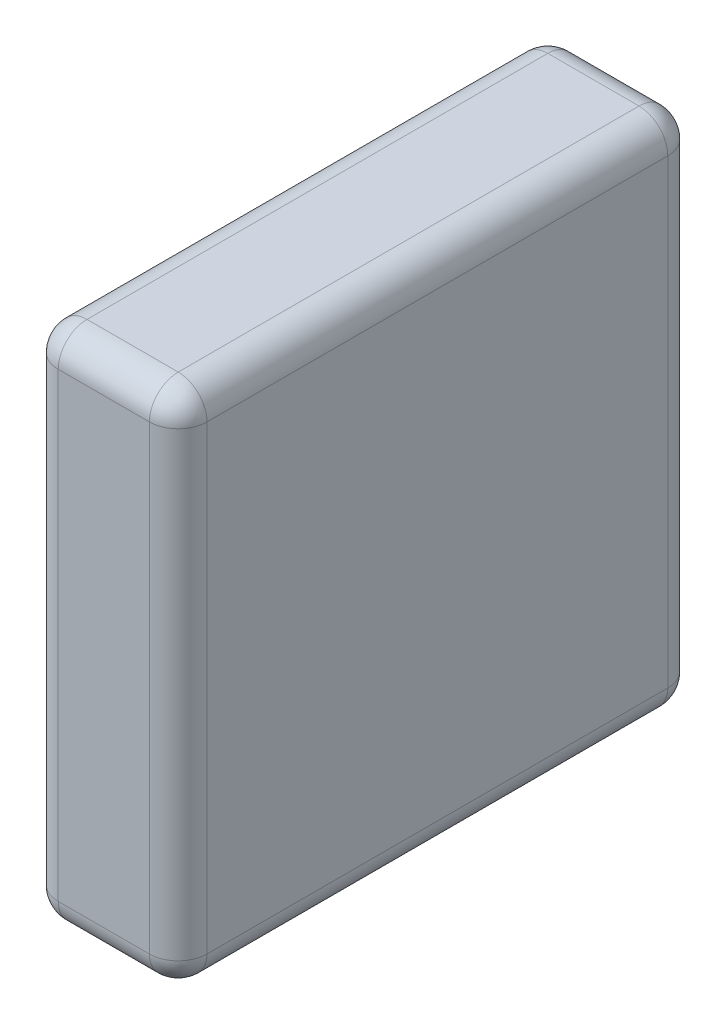
ISO-10303-21;
HEADER;
FILE_DESCRIPTION(('STEP AP214'),'2;1');
FILE_NAME('part.step','',(''),(''),'','','');
FILE_SCHEMA(('AUTOMOTIVE_DESIGN { 1 0 10303 214 1 1 1 1 }'));
ENDSEC;
DATA;
#1=APPLICATION_CONTEXT('core data for automotive mechanical design processes');
#2=APPLICATION_PROTOCOL_DEFINITION('international standard','automotive_design',2000,#1);
#3=PRODUCT_CONTEXT('',#1,'mechanical');
#4=PRODUCT('Part','Part','',(#3));
#5=PRODUCT_RELATED_PRODUCT_CATEGORY('part','',(#4));
#6=PRODUCT_DEFINITION_FORMATION('','',#4);
#7=PRODUCT_DEFINITION_CONTEXT('part definition',#1,'design');
#8=PRODUCT_DEFINITION('design','',#6,#7);
#9=PRODUCT_DEFINITION_SHAPE('','',#8);
#10=(LENGTH_UNIT() NAMED_UNIT(*) SI_UNIT(.MILLI.,.METRE.));
#11=(NAMED_UNIT(*) PLANE_ANGLE_UNIT() SI_UNIT($,.RADIAN.));
#12=(NAMED_UNIT(*) SI_UNIT($,.STERADIAN.) SOLID_ANGLE_UNIT());
#13=UNCERTAINTY_MEASURE_WITH_UNIT(LENGTH_MEASURE(1.E-05),#10,'distance_accuracy_value','');
#14=(GEOMETRIC_REPRESENTATION_CONTEXT(3) GLOBAL_UNCERTAINTY_ASSIGNED_CONTEXT((#13)) GLOBAL_UNIT_ASSIGNED_CONTEXT((#10,
#11,#12)) REPRESENTATION_CONTEXT('',''));
#15=CARTESIAN_POINT('',(0.,0.,0.));
#16=DIRECTION('',(0.,0.,1.));
#17=DIRECTION('',(1.,0.,0.));
#18=AXIS2_PLACEMENT_3D('',#15,#16,#17);
#19=CARTESIAN_POINT('',(4.75,24.,24.));
#20=DIRECTION('',(0.,-1.,0.));
#21=DIRECTION('',(1.,0.,0.));
#22=AXIS2_PLACEMENT_3D('',#19,#20,#21);
#23=SPHERICAL_SURFACE('',#22,3.);
#24=CARTESIAN_POINT('',(4.75,24.,24.));
#25=DIRECTION('',(0.,0.,-1.));
#26=DIRECTION('',(1.,0.,0.));
#27=AXIS2_PLACEMENT_3D('',#24,#25,#26);
#28=CIRCLE('',#27,3.);
#29=CARTESIAN_POINT('',(4.75,27.,24.));
#30=VERTEX_POINT('',#29);
#31=CARTESIAN_POINT('',(7.75,24.,24.));
#32=VERTEX_POINT('',#31);
#33=EDGE_CURVE('E10',#30,#32,#28,.T.);
#34=ORIENTED_EDGE('',*,*,#33,.F.);
#35=CARTESIAN_POINT('',(4.75,24.,24.));
#36=DIRECTION('',(1.,0.,0.));
#37=DIRECTION('',(0.,0.,1.));
#38=AXIS2_PLACEMENT_3D('',#35,#36,#37);
#39=CIRCLE('',#38,3.);
#40=CARTESIAN_POINT('',(4.75,24.,27.));
#41=VERTEX_POINT('',#40);
#42=EDGE_CURVE('E203',#30,#41,#39,.T.);
#43=ORIENTED_EDGE('',*,*,#42,.T.);
#44=CARTESIAN_POINT('',(4.75,24.,24.));
#45=DIRECTION('',(0.,-1.,0.));
#46=DIRECTION('',(1.,0.,0.));
#47=AXIS2_PLACEMENT_3D('',#44,#45,#46);
#48=CIRCLE('',#47,3.);
#49=EDGE_CURVE('E282',#32,#41,#48,.T.);
#50=ORIENTED_EDGE('',*,*,#49,.F.);
#51=EDGE_LOOP('',(#34,#43,#50));
#52=FACE_BOUND('',#51,.T.);
#53=ADVANCED_FACE('F16',(#52),#23,.T.);
#54=CARTESIAN_POINT('',(4.75,24.,-24.));
#55=DIRECTION('',(0.,0.,1.));
#56=DIRECTION('',(1.,0.,0.));
#57=AXIS2_PLACEMENT_3D('',#54,#55,#56);
#58=SPHERICAL_SURFACE('',#57,3.);
#59=CARTESIAN_POINT('',(4.75,24.,-24.));
#60=DIRECTION('',(0.,-1.,0.));
#61=DIRECTION('',(1.,0.,0.));
#62=AXIS2_PLACEMENT_3D('',#59,#60,#61);
#63=CIRCLE('',#62,3.);
#64=CARTESIAN_POINT('',(4.75,24.,-27.));
#65=VERTEX_POINT('',#64);
#66=CARTESIAN_POINT('',(7.75,24.,-24.));
#67=VERTEX_POINT('',#66);
#68=EDGE_CURVE('E272',#65,#67,#63,.T.);
#69=ORIENTED_EDGE('',*,*,#68,.F.);
#70=CARTESIAN_POINT('',(4.75,24.,-24.));
#71=DIRECTION('',(1.,0.,0.));
#72=DIRECTION('',(0.,1.,0.));
#73=AXIS2_PLACEMENT_3D('',#70,#71,#72);
#74=CIRCLE('',#73,3.);
#75=CARTESIAN_POINT('',(4.75,27.,-24.));
#76=VERTEX_POINT('',#75);
#77=EDGE_CURVE('E260',#65,#76,#74,.T.);
#78=ORIENTED_EDGE('',*,*,#77,.T.);
#79=CARTESIAN_POINT('',(4.75,24.,-24.));
#80=DIRECTION('',(0.,0.,1.));
#81=DIRECTION('',(1.,0.,0.));
#82=AXIS2_PLACEMENT_3D('',#79,#80,#81);
#83=CIRCLE('',#82,3.);
#84=EDGE_CURVE('E24',#67,#76,#83,.T.);
#85=ORIENTED_EDGE('',*,*,#84,.F.);
#86=EDGE_LOOP('',(#69,#78,#85));
#87=FACE_BOUND('',#86,.T.);
#88=ADVANCED_FACE('F295',(#87),#58,.T.);
#89=CARTESIAN_POINT('',(7.75,-27.,-27.));
#90=DIRECTION('',(1.,0.,0.));
#91=DIRECTION('',(0.,1.,0.));
#92=AXIS2_PLACEMENT_3D('',#89,#90,#91);
#93=PLANE('',#92);
#94=DIRECTION('',(0.,0.,1.));
#95=VECTOR('',#94,1.);
#96=CARTESIAN_POINT('',(7.75,-24.,-27.));
#97=LINE('',#96,#95);
#98=CARTESIAN_POINT('',(7.75,-24.,-24.));
#99=VERTEX_POINT('',#98);
#100=CARTESIAN_POINT('',(7.75,-24.,24.));
#101=VERTEX_POINT('',#100);
#102=EDGE_CURVE('E256',#99,#101,#97,.T.);
#103=ORIENTED_EDGE('',*,*,#102,.F.);
#104=DIRECTION('',(0.,1.,0.));
#105=VECTOR('',#104,1.);
#106=CARTESIAN_POINT('',(7.75,-27.,-24.));
#107=LINE('',#106,#105);
#108=EDGE_CURVE('E208',#99,#67,#107,.T.);
#109=ORIENTED_EDGE('',*,*,#108,.T.);
#110=DIRECTION('',(0.,0.,1.));
#111=VECTOR('',#110,1.);
#112=CARTESIAN_POINT('',(7.75,24.,-27.));
#113=LINE('',#112,#111);
#114=EDGE_CURVE('E288',#67,#32,#113,.T.);
#115=ORIENTED_EDGE('',*,*,#114,.T.);
#116=DIRECTION('',(0.,1.,0.));
#117=VECTOR('',#116,1.);
#118=CARTESIAN_POINT('',(7.75,-27.,24.));
#119=LINE('',#118,#117);
#120=EDGE_CURVE('E207',#101,#32,#119,.T.);
#121=ORIENTED_EDGE('',*,*,#120,.F.);
#122=EDGE_LOOP('',(#103,#109,#115,#121));
#123=FACE_BOUND('',#122,.T.);
#124=ADVANCED_FACE('F379',(#123),#93,.T.);
#125=CARTESIAN_POINT('',(4.75,-24.,24.));
#126=DIRECTION('',(0.,0.,-1.));
#127=DIRECTION('',(1.,0.,0.));
#128=AXIS2_PLACEMENT_3D('',#125,#126,#127);
#129=SPHERICAL_SURFACE('',#128,3.);
#130=CARTESIAN_POINT('',(4.75,-24.,24.));
#131=DIRECTION('',(0.,1.,0.));
#132=DIRECTION('',(1.,0.,0.));
#133=AXIS2_PLACEMENT_3D('',#130,#131,#132);
#134=CIRCLE('',#133,3.);
#135=CARTESIAN_POINT('',(4.75,-24.,27.));
#136=VERTEX_POINT('',#135);
#137=EDGE_CURVE('E285',#136,#101,#134,.T.);
#138=ORIENTED_EDGE('',*,*,#137,.F.);
#139=CARTESIAN_POINT('',(4.75,-24.,24.));
#140=DIRECTION('',(1.,0.,0.));
#141=DIRECTION('',(0.,-1.,0.));
#142=AXIS2_PLACEMENT_3D('',#139,#140,#141);
#143=CIRCLE('',#142,3.);
#144=CARTESIAN_POINT('',(4.75,-27.,24.));
#145=VERTEX_POINT('',#144);
#146=EDGE_CURVE('E140',#136,#145,#143,.T.);
#147=ORIENTED_EDGE('',*,*,#146,.T.);
#148=CARTESIAN_POINT('',(4.75,-24.,24.));
#149=DIRECTION('',(0.,0.,-1.));
#150=DIRECTION('',(1.,0.,0.));
#151=AXIS2_PLACEMENT_3D('',#148,#149,#150);
#152=CIRCLE('',#151,3.);
#153=EDGE_CURVE('E255',#101,#145,#152,.T.);
#154=ORIENTED_EDGE('',*,*,#153,.F.);
#155=EDGE_LOOP('',(#138,#147,#154));
#156=FACE_BOUND('',#155,.T.);
#157=ADVANCED_FACE('F374',(#156),#129,.T.);
#158=CARTESIAN_POINT('',(4.75,-24.,-24.));
#159=DIRECTION('',(0.,0.,1.));
#160=DIRECTION('',(1.,0.,0.));
#161=AXIS2_PLACEMENT_3D('',#158,#159,#160);
#162=SPHERICAL_SURFACE('',#161,3.);
#163=CARTESIAN_POINT('',(4.75,-24.,-24.));
#164=DIRECTION('',(0.,0.,-1.));
#165=DIRECTION('',(1.,0.,0.));
#166=AXIS2_PLACEMENT_3D('',#163,#164,#165);
#167=CIRCLE('',#166,3.);
#168=CARTESIAN_POINT('',(4.75,-27.,-24.));
#169=VERTEX_POINT('',#168);
#170=EDGE_CURVE('E261',#99,#169,#167,.T.);
#171=ORIENTED_EDGE('',*,*,#170,.T.);
#172=CARTESIAN_POINT('',(4.75,-24.,-24.));
#173=DIRECTION('',(-1.,0.,0.));
#174=DIRECTION('',(0.,-1.,0.));
#175=AXIS2_PLACEMENT_3D('',#172,#173,#174);
#176=CIRCLE('',#175,3.);
#177=CARTESIAN_POINT('',(4.75,-24.,-27.));
#178=VERTEX_POINT('',#177);
#179=EDGE_CURVE('E249',#178,#169,#176,.T.);
#180=ORIENTED_EDGE('',*,*,#179,.F.);
#181=CARTESIAN_POINT('',(4.75,-24.,-24.));
#182=DIRECTION('',(0.,-1.,0.));
#183=DIRECTION('',(1.,0.,0.));
#184=AXIS2_PLACEMENT_3D('',#181,#182,#183);
#185=CIRCLE('',#184,3.);
#186=EDGE_CURVE('E268',#178,#99,#185,.T.);
#187=ORIENTED_EDGE('',*,*,#186,.T.);
#188=EDGE_LOOP('',(#171,#180,#187));
#189=FACE_BOUND('',#188,.T.);
#190=ADVANCED_FACE('F406',(#189),#162,.T.);
#191=CARTESIAN_POINT('',(4.75,24.,-27.));
#192=DIRECTION('',(0.,0.,1.));
#193=DIRECTION('',(1.,0.,0.));
#194=AXIS2_PLACEMENT_3D('',#191,#192,#193);
#195=CYLINDRICAL_SURFACE('',#194,3.);
#196=ORIENTED_EDGE('',*,*,#114,.F.);
#197=ORIENTED_EDGE('',*,*,#84,.T.);
#198=DIRECTION('',(0.,0.,1.));
#199=VECTOR('',#198,1.);
#200=CARTESIAN_POINT('',(4.75,27.,-27.));
#201=LINE('',#200,#199);
#202=EDGE_CURVE('E197',#76,#30,#201,.T.);
#203=ORIENTED_EDGE('',*,*,#202,.T.);
#204=ORIENTED_EDGE('',*,*,#33,.T.);
#205=EDGE_LOOP('',(#196,#197,#203,#204));
#206=FACE_BOUND('',#205,.T.);
#207=ADVANCED_FACE('F292',(#206),#195,.T.);
#208=CARTESIAN_POINT('',(4.75,-27.,24.));
#209=DIRECTION('',(0.,1.,0.));
#210=DIRECTION('',(1.,0.,0.));
#211=AXIS2_PLACEMENT_3D('',#208,#209,#210);
#212=CYLINDRICAL_SURFACE('',#211,3.);
#213=ORIENTED_EDGE('',*,*,#120,.T.);
#214=ORIENTED_EDGE('',*,*,#49,.T.);
#215=DIRECTION('',(0.,1.,0.));
#216=VECTOR('',#215,1.);
#217=CARTESIAN_POINT('',(4.75,-27.,27.));
#218=LINE('',#217,#216);
#219=EDGE_CURVE('E146',#136,#41,#218,.T.);
#220=ORIENTED_EDGE('',*,*,#219,.F.);
#221=ORIENTED_EDGE('',*,*,#137,.T.);
#222=EDGE_LOOP('',(#213,#214,#220,#221));
#223=FACE_BOUND('',#222,.T.);
#224=ADVANCED_FACE('F377',(#223),#212,.T.);
#225=CARTESIAN_POINT('',(-7.75,24.,24.));
#226=DIRECTION('',(1.,0.,0.));
#227=DIRECTION('',(0.,1.,0.));
#228=AXIS2_PLACEMENT_3D('',#225,#226,#227);
#229=CYLINDRICAL_SURFACE('',#228,3.);
#230=CARTESIAN_POINT('',(-4.75,24.,24.));
#231=DIRECTION('',(1.,0.,0.));
#232=DIRECTION('',(0.,0.,1.));
#233=AXIS2_PLACEMENT_3D('',#230,#231,#232);
#234=CIRCLE('',#233,3.);
#235=CARTESIAN_POINT('',(-4.75,27.,24.));
#236=VERTEX_POINT('',#235);
#237=CARTESIAN_POINT('',(-4.75,24.,27.));
#238=VERTEX_POINT('',#237);
#239=EDGE_CURVE('E198',#236,#238,#234,.T.);
#240=ORIENTED_EDGE('',*,*,#239,.T.);
#241=DIRECTION('',(1.,0.,0.));
#242=VECTOR('',#241,1.);
#243=CARTESIAN_POINT('',(-7.75,24.,27.));
#244=LINE('',#243,#242);
#245=EDGE_CURVE('E165',#238,#41,#244,.T.);
#246=ORIENTED_EDGE('',*,*,#245,.T.);
#247=ORIENTED_EDGE('',*,*,#42,.F.);
#248=DIRECTION('',(1.,0.,0.));
#249=VECTOR('',#248,1.);
#250=CARTESIAN_POINT('',(-7.75,27.,24.));
#251=LINE('',#250,#249);
#252=EDGE_CURVE('E193',#236,#30,#251,.T.);
#253=ORIENTED_EDGE('',*,*,#252,.F.);
#254=EDGE_LOOP('',(#240,#246,#247,#253));
#255=FACE_BOUND('',#254,.T.);
#256=ADVANCED_FACE('F306',(#255),#229,.T.);
#257=CARTESIAN_POINT('',(4.75,-27.,-24.));
#258=DIRECTION('',(0.,1.,0.));
#259=DIRECTION('',(1.,0.,0.));
#260=AXIS2_PLACEMENT_3D('',#257,#258,#259);
#261=CYLINDRICAL_SURFACE('',#260,3.);
#262=ORIENTED_EDGE('',*,*,#186,.F.);
#263=DIRECTION('',(0.,1.,0.));
#264=VECTOR('',#263,1.);
#265=CARTESIAN_POINT('',(4.75,-27.,-27.));
#266=LINE('',#265,#264);
#267=EDGE_CURVE('E229',#178,#65,#266,.T.);
#268=ORIENTED_EDGE('',*,*,#267,.T.);
#269=ORIENTED_EDGE('',*,*,#68,.T.);
#270=ORIENTED_EDGE('',*,*,#108,.F.);
#271=EDGE_LOOP('',(#262,#268,#269,#270));
#272=FACE_BOUND('',#271,.T.);
#273=ADVANCED_FACE('F432',(#272),#261,.T.);
#274=CARTESIAN_POINT('',(-7.75,24.,-24.));
#275=DIRECTION('',(1.,0.,0.));
#276=DIRECTION('',(0.,1.,0.));
#277=AXIS2_PLACEMENT_3D('',#274,#275,#276);
#278=CYLINDRICAL_SURFACE('',#277,3.);
#279=DIRECTION('',(1.,0.,0.));
#280=VECTOR('',#279,1.);
#281=CARTESIAN_POINT('',(-7.75,27.,-24.));
#282=LINE('',#281,#280);
#283=CARTESIAN_POINT('',(-4.75,27.,-24.));
#284=VERTEX_POINT('',#283);
#285=EDGE_CURVE('E228',#284,#76,#282,.T.);
#286=ORIENTED_EDGE('',*,*,#285,.T.);
#287=ORIENTED_EDGE('',*,*,#77,.F.);
#288=DIRECTION('',(1.,0.,0.));
#289=VECTOR('',#288,1.);
#290=CARTESIAN_POINT('',(-7.75,24.,-27.));
#291=LINE('',#290,#289);
#292=CARTESIAN_POINT('',(-4.75,24.,-27.));
#293=VERTEX_POINT('',#292);
#294=EDGE_CURVE('E225',#293,#65,#291,.T.);
#295=ORIENTED_EDGE('',*,*,#294,.F.);
#296=CARTESIAN_POINT('',(-4.75,24.,-24.));
#297=DIRECTION('',(1.,0.,0.));
#298=DIRECTION('',(0.,1.,0.));
#299=AXIS2_PLACEMENT_3D('',#296,#297,#298);
#300=CIRCLE('',#299,3.);
#301=EDGE_CURVE('E147',#293,#284,#300,.T.);
#302=ORIENTED_EDGE('',*,*,#301,.T.);
#303=EDGE_LOOP('',(#286,#287,#295,#302));
#304=FACE_BOUND('',#303,.T.);
#305=ADVANCED_FACE('F298',(#304),#278,.T.);
#306=CARTESIAN_POINT('',(4.75,-24.,-27.));
#307=DIRECTION('',(0.,0.,1.));
#308=DIRECTION('',(1.,0.,0.));
#309=AXIS2_PLACEMENT_3D('',#306,#307,#308);
#310=CYLINDRICAL_SURFACE('',#309,3.);
#311=ORIENTED_EDGE('',*,*,#153,.T.);
#312=DIRECTION('',(0.,0.,1.));
#313=VECTOR('',#312,1.);
#314=CARTESIAN_POINT('',(4.75,-27.,-27.));
#315=LINE('',#314,#313);
#316=EDGE_CURVE('E218',#169,#145,#315,.T.);
#317=ORIENTED_EDGE('',*,*,#316,.F.);
#318=ORIENTED_EDGE('',*,*,#170,.F.);
#319=ORIENTED_EDGE('',*,*,#102,.T.);
#320=EDGE_LOOP('',(#311,#317,#318,#319));
#321=FACE_BOUND('',#320,.T.);
#322=ADVANCED_FACE('F370',(#321),#310,.T.);
#323=CARTESIAN_POINT('',(-7.75,-24.,24.));
#324=DIRECTION('',(1.,0.,0.));
#325=DIRECTION('',(0.,-1.,0.));
#326=AXIS2_PLACEMENT_3D('',#323,#324,#325);
#327=CYLINDRICAL_SURFACE('',#326,3.);
#328=DIRECTION('',(1.,0.,0.));
#329=VECTOR('',#328,1.);
#330=CARTESIAN_POINT('',(-7.75,-27.,24.));
#331=LINE('',#330,#329);
#332=CARTESIAN_POINT('',(-4.75,-27.,24.));
#333=VERTEX_POINT('',#332);
#334=EDGE_CURVE('E222',#333,#145,#331,.T.);
#335=ORIENTED_EDGE('',*,*,#334,.T.);
#336=ORIENTED_EDGE('',*,*,#146,.F.);
#337=DIRECTION('',(1.,0.,0.));
#338=VECTOR('',#337,1.);
#339=CARTESIAN_POINT('',(-7.75,-24.,27.));
#340=LINE('',#339,#338);
#341=CARTESIAN_POINT('',(-4.75,-24.,27.));
#342=VERTEX_POINT('',#341);
#343=EDGE_CURVE('E133',#342,#136,#340,.T.);
#344=ORIENTED_EDGE('',*,*,#343,.F.);
#345=CARTESIAN_POINT('',(-4.75,-24.,24.));
#346=DIRECTION('',(1.,0.,0.));
#347=DIRECTION('',(0.,-1.,0.));
#348=AXIS2_PLACEMENT_3D('',#345,#346,#347);
#349=CIRCLE('',#348,3.);
#350=EDGE_CURVE('E137',#342,#333,#349,.T.);
#351=ORIENTED_EDGE('',*,*,#350,.T.);
#352=EDGE_LOOP('',(#335,#336,#344,#351));
#353=FACE_BOUND('',#352,.T.);
#354=ADVANCED_FACE('F136',(#353),#327,.T.);
#355=CARTESIAN_POINT('',(-7.75,-24.,-24.));
#356=DIRECTION('',(1.,0.,0.));
#357=DIRECTION('',(0.,-1.,0.));
#358=AXIS2_PLACEMENT_3D('',#355,#356,#357);
#359=CYLINDRICAL_SURFACE('',#358,3.);
#360=CARTESIAN_POINT('',(-4.75,-24.,-24.));
#361=DIRECTION('',(-1.,0.,0.));
#362=DIRECTION('',(0.,-1.,0.));
#363=AXIS2_PLACEMENT_3D('',#360,#361,#362);
#364=CIRCLE('',#363,3.);
#365=CARTESIAN_POINT('',(-4.75,-24.,-27.));
#366=VERTEX_POINT('',#365);
#367=CARTESIAN_POINT('',(-4.75,-27.,-24.));
#368=VERTEX_POINT('',#367);
#369=EDGE_CURVE('E158',#366,#368,#364,.T.);
#370=ORIENTED_EDGE('',*,*,#369,.F.);
#371=DIRECTION('',(1.,0.,0.));
#372=VECTOR('',#371,1.);
#373=CARTESIAN_POINT('',(-7.75,-24.,-27.));
#374=LINE('',#373,#372);
#375=EDGE_CURVE('E233',#366,#178,#374,.T.);
#376=ORIENTED_EDGE('',*,*,#375,.T.);
#377=ORIENTED_EDGE('',*,*,#179,.T.);
#378=DIRECTION('',(1.,0.,0.));
#379=VECTOR('',#378,1.);
#380=CARTESIAN_POINT('',(-7.75,-27.,-24.));
#381=LINE('',#380,#379);
#382=EDGE_CURVE('E157',#368,#169,#381,.T.);
#383=ORIENTED_EDGE('',*,*,#382,.F.);
#384=EDGE_LOOP('',(#370,#376,#377,#383));
#385=FACE_BOUND('',#384,.T.);
#386=ADVANCED_FACE('F398',(#385),#359,.T.);
#387=CARTESIAN_POINT('',(-7.75,27.,-27.));
#388=DIRECTION('',(0.,1.,0.));
#389=DIRECTION('',(1.,0.,0.));
#390=AXIS2_PLACEMENT_3D('',#387,#388,#389);
#391=PLANE('',#390);
#392=DIRECTION('',(0.,0.,1.));
#393=VECTOR('',#392,1.);
#394=CARTESIAN_POINT('',(-4.75,27.,-27.));
#395=LINE('',#394,#393);
#396=EDGE_CURVE('E192',#284,#236,#395,.T.);
#397=ORIENTED_EDGE('',*,*,#396,.T.);
#398=ORIENTED_EDGE('',*,*,#252,.T.);
#399=ORIENTED_EDGE('',*,*,#202,.F.);
#400=ORIENTED_EDGE('',*,*,#285,.F.);
#401=EDGE_LOOP('',(#397,#398,#399,#400));
#402=FACE_BOUND('',#401,.T.);
#403=ADVANCED_FACE('F300',(#402),#391,.T.);
#404=CARTESIAN_POINT('',(-4.75,24.,24.));
#405=DIRECTION('',(0.,-1.,0.));
#406=DIRECTION('',(-1.,0.,0.));
#407=AXIS2_PLACEMENT_3D('',#404,#405,#406);
#408=SPHERICAL_SURFACE('',#407,3.);
#409=CARTESIAN_POINT('',(-4.75,24.,24.));
#410=DIRECTION('',(0.,1.,0.));
#411=DIRECTION('',(-1.,0.,0.));
#412=AXIS2_PLACEMENT_3D('',#409,#410,#411);
#413=CIRCLE('',#412,3.);
#414=CARTESIAN_POINT('',(-7.75,24.,24.));
#415=VERTEX_POINT('',#414);
#416=EDGE_CURVE('E170',#415,#238,#413,.T.);
#417=ORIENTED_EDGE('',*,*,#416,.T.);
#418=ORIENTED_EDGE('',*,*,#239,.F.);
#419=CARTESIAN_POINT('',(-4.75,24.,24.));
#420=DIRECTION('',(0.,0.,1.));
#421=DIRECTION('',(-1.,0.,0.));
#422=AXIS2_PLACEMENT_3D('',#419,#420,#421);
#423=CIRCLE('',#422,3.);
#424=EDGE_CURVE('E189',#236,#415,#423,.T.);
#425=ORIENTED_EDGE('',*,*,#424,.T.);
#426=EDGE_LOOP('',(#417,#418,#425));
#427=FACE_BOUND('',#426,.T.);
#428=ADVANCED_FACE('F308',(#427),#408,.T.);
#429=CARTESIAN_POINT('',(-7.75,-27.,27.));
#430=DIRECTION('',(0.,0.,1.));
#431=DIRECTION('',(1.,0.,0.));
#432=AXIS2_PLACEMENT_3D('',#429,#430,#431);
#433=PLANE('',#432);
#434=DIRECTION('',(0.,1.,0.));
#435=VECTOR('',#434,1.);
#436=CARTESIAN_POINT('',(-4.75,-27.,27.));
#437=LINE('',#436,#435);
#438=EDGE_CURVE('E162',#342,#238,#437,.T.);
#439=ORIENTED_EDGE('',*,*,#438,.F.);
#440=ORIENTED_EDGE('',*,*,#343,.T.);
#441=ORIENTED_EDGE('',*,*,#219,.T.);
#442=ORIENTED_EDGE('',*,*,#245,.F.);
#443=EDGE_LOOP('',(#439,#440,#441,#442));
#444=FACE_BOUND('',#443,.T.);
#445=ADVANCED_FACE('F163',(#444),#433,.T.);
#446=CARTESIAN_POINT('',(-4.75,24.,-24.));
#447=DIRECTION('',(0.,0.,1.));
#448=DIRECTION('',(-1.,0.,0.));
#449=AXIS2_PLACEMENT_3D('',#446,#447,#448);
#450=SPHERICAL_SURFACE('',#449,3.);
#451=CARTESIAN_POINT('',(-4.75,24.,-24.));
#452=DIRECTION('',(0.,0.,-1.));
#453=DIRECTION('',(-1.,0.,0.));
#454=AXIS2_PLACEMENT_3D('',#451,#452,#453);
#455=CIRCLE('',#454,3.);
#456=CARTESIAN_POINT('',(-7.75,24.,-24.));
#457=VERTEX_POINT('',#456);
#458=EDGE_CURVE('E202',#457,#284,#455,.T.);
#459=ORIENTED_EDGE('',*,*,#458,.T.);
#460=ORIENTED_EDGE('',*,*,#301,.F.);
#461=CARTESIAN_POINT('',(-4.75,24.,-24.));
#462=DIRECTION('',(0.,1.,0.));
#463=DIRECTION('',(-1.,0.,0.));
#464=AXIS2_PLACEMENT_3D('',#461,#462,#463);
#465=CIRCLE('',#464,3.);
#466=EDGE_CURVE('E332',#293,#457,#465,.T.);
#467=ORIENTED_EDGE('',*,*,#466,.T.);
#468=EDGE_LOOP('',(#459,#460,#467));
#469=FACE_BOUND('',#468,.T.);
#470=ADVANCED_FACE('F403',(#469),#450,.T.);
#471=CARTESIAN_POINT('',(-7.75,-27.,-27.));
#472=DIRECTION('',(0.,0.,1.));
#473=DIRECTION('',(1.,0.,0.));
#474=AXIS2_PLACEMENT_3D('',#471,#472,#473);
#475=PLANE('',#474);
#476=ORIENTED_EDGE('',*,*,#294,.T.);
#477=ORIENTED_EDGE('',*,*,#267,.F.);
#478=ORIENTED_EDGE('',*,*,#375,.F.);
#479=DIRECTION('',(0.,1.,0.));
#480=VECTOR('',#479,1.);
#481=CARTESIAN_POINT('',(-4.75,-27.,-27.));
#482=LINE('',#481,#480);
#483=EDGE_CURVE('E182',#366,#293,#482,.T.);
#484=ORIENTED_EDGE('',*,*,#483,.T.);
#485=EDGE_LOOP('',(#476,#477,#478,#484));
#486=FACE_BOUND('',#485,.T.);
#487=ADVANCED_FACE('F353',(#486),#475,.F.);
#488=CARTESIAN_POINT('',(-7.75,-27.,-27.));
#489=DIRECTION('',(0.,1.,0.));
#490=DIRECTION('',(1.,0.,0.));
#491=AXIS2_PLACEMENT_3D('',#488,#489,#490);
#492=PLANE('',#491);
#493=ORIENTED_EDGE('',*,*,#382,.T.);
#494=ORIENTED_EDGE('',*,*,#316,.T.);
#495=ORIENTED_EDGE('',*,*,#334,.F.);
#496=DIRECTION('',(0.,0.,1.));
#497=VECTOR('',#496,1.);
#498=CARTESIAN_POINT('',(-4.75,-27.,-27.));
#499=LINE('',#498,#497);
#500=EDGE_CURVE('E333',#368,#333,#499,.T.);
#501=ORIENTED_EDGE('',*,*,#500,.F.);
#502=EDGE_LOOP('',(#493,#494,#495,#501));
#503=FACE_BOUND('',#502,.T.);
#504=ADVANCED_FACE('F366',(#503),#492,.F.);
#505=CARTESIAN_POINT('',(-4.75,-24.,24.));
#506=DIRECTION('',(0.,0.,-1.));
#507=DIRECTION('',(-1.,0.,0.));
#508=AXIS2_PLACEMENT_3D('',#505,#506,#507);
#509=SPHERICAL_SURFACE('',#508,3.);
#510=CARTESIAN_POINT('',(-4.75,-24.,24.));
#511=DIRECTION('',(0.,0.,1.));
#512=DIRECTION('',(-1.,0.,0.));
#513=AXIS2_PLACEMENT_3D('',#510,#511,#512);
#514=CIRCLE('',#513,3.);
#515=CARTESIAN_POINT('',(-7.75,-24.,24.));
#516=VERTEX_POINT('',#515);
#517=EDGE_CURVE('E154',#516,#333,#514,.T.);
#518=ORIENTED_EDGE('',*,*,#517,.T.);
#519=ORIENTED_EDGE('',*,*,#350,.F.);
#520=CARTESIAN_POINT('',(-4.75,-24.,24.));
#521=DIRECTION('',(0.,-1.,0.));
#522=DIRECTION('',(-1.,0.,0.));
#523=AXIS2_PLACEMENT_3D('',#520,#521,#522);
#524=CIRCLE('',#523,3.);
#525=EDGE_CURVE('E152',#342,#516,#524,.T.);
#526=ORIENTED_EDGE('',*,*,#525,.T.);
#527=EDGE_LOOP('',(#518,#519,#526));
#528=FACE_BOUND('',#527,.T.);
#529=ADVANCED_FACE('F150',(#528),#509,.T.);
#530=CARTESIAN_POINT('',(-4.75,-24.,-24.));
#531=DIRECTION('',(0.,0.,1.));
#532=DIRECTION('',(-1.,0.,0.));
#533=AXIS2_PLACEMENT_3D('',#530,#531,#532);
#534=SPHERICAL_SURFACE('',#533,3.);
#535=CARTESIAN_POINT('',(-4.75,-24.,-24.));
#536=DIRECTION('',(0.,1.,0.));
#537=DIRECTION('',(-1.,0.,0.));
#538=AXIS2_PLACEMENT_3D('',#535,#536,#537);
#539=CIRCLE('',#538,3.);
#540=CARTESIAN_POINT('',(-7.75,-24.,-24.));
#541=VERTEX_POINT('',#540);
#542=EDGE_CURVE('E177',#366,#541,#539,.T.);
#543=ORIENTED_EDGE('',*,*,#542,.F.);
#544=ORIENTED_EDGE('',*,*,#369,.T.);
#545=CARTESIAN_POINT('',(-4.75,-24.,-24.));
#546=DIRECTION('',(0.,0.,1.));
#547=DIRECTION('',(-1.,0.,0.));
#548=AXIS2_PLACEMENT_3D('',#545,#546,#547);
#549=CIRCLE('',#548,3.);
#550=EDGE_CURVE('E337',#541,#368,#549,.T.);
#551=ORIENTED_EDGE('',*,*,#550,.F.);
#552=EDGE_LOOP('',(#543,#544,#551));
#553=FACE_BOUND('',#552,.T.);
#554=ADVANCED_FACE('F361',(#553),#534,.T.);
#555=CARTESIAN_POINT('',(-4.75,24.,-27.));
#556=DIRECTION('',(0.,0.,1.));
#557=DIRECTION('',(-1.,0.,0.));
#558=AXIS2_PLACEMENT_3D('',#555,#556,#557);
#559=CYLINDRICAL_SURFACE('',#558,3.);
#560=ORIENTED_EDGE('',*,*,#424,.F.);
#561=ORIENTED_EDGE('',*,*,#396,.F.);
#562=ORIENTED_EDGE('',*,*,#458,.F.);
#563=DIRECTION('',(0.,0.,1.));
#564=VECTOR('',#563,1.);
#565=CARTESIAN_POINT('',(-7.75,24.,-27.));
#566=LINE('',#565,#564);
#567=EDGE_CURVE('E312',#457,#415,#566,.T.);
#568=ORIENTED_EDGE('',*,*,#567,.T.);
#569=EDGE_LOOP('',(#560,#561,#562,#568));
#570=FACE_BOUND('',#569,.T.);
#571=ADVANCED_FACE('F313',(#570),#559,.T.);
#572=CARTESIAN_POINT('',(-4.75,-27.,24.));
#573=DIRECTION('',(0.,1.,0.));
#574=DIRECTION('',(-1.,0.,0.));
#575=AXIS2_PLACEMENT_3D('',#572,#573,#574);
#576=CYLINDRICAL_SURFACE('',#575,3.);
#577=ORIENTED_EDGE('',*,*,#525,.F.);
#578=ORIENTED_EDGE('',*,*,#438,.T.);
#579=ORIENTED_EDGE('',*,*,#416,.F.);
#580=DIRECTION('',(0.,1.,0.));
#581=VECTOR('',#580,1.);
#582=CARTESIAN_POINT('',(-7.75,-27.,24.));
#583=LINE('',#582,#581);
#584=EDGE_CURVE('E175',#516,#415,#583,.T.);
#585=ORIENTED_EDGE('',*,*,#584,.F.);
#586=EDGE_LOOP('',(#577,#578,#579,#585));
#587=FACE_BOUND('',#586,.T.);
#588=ADVANCED_FACE('F173',(#587),#576,.T.);
#589=CARTESIAN_POINT('',(-4.75,-27.,-24.));
#590=DIRECTION('',(0.,1.,0.));
#591=DIRECTION('',(-1.,0.,0.));
#592=AXIS2_PLACEMENT_3D('',#589,#590,#591);
#593=CYLINDRICAL_SURFACE('',#592,3.);
#594=DIRECTION('',(0.,1.,0.));
#595=VECTOR('',#594,1.);
#596=CARTESIAN_POINT('',(-7.75,-27.,-24.));
#597=LINE('',#596,#595);
#598=EDGE_CURVE('E318',#541,#457,#597,.T.);
#599=ORIENTED_EDGE('',*,*,#598,.T.);
#600=ORIENTED_EDGE('',*,*,#466,.F.);
#601=ORIENTED_EDGE('',*,*,#483,.F.);
#602=ORIENTED_EDGE('',*,*,#542,.T.);
#603=EDGE_LOOP('',(#599,#600,#601,#602));
#604=FACE_BOUND('',#603,.T.);
#605=ADVANCED_FACE('F357',(#604),#593,.T.);
#606=CARTESIAN_POINT('',(-4.75,-24.,-27.));
#607=DIRECTION('',(0.,0.,1.));
#608=DIRECTION('',(-1.,0.,0.));
#609=AXIS2_PLACEMENT_3D('',#606,#607,#608);
#610=CYLINDRICAL_SURFACE('',#609,3.);
#611=DIRECTION('',(0.,0.,1.));
#612=VECTOR('',#611,1.);
#613=CARTESIAN_POINT('',(-7.75,-24.,-27.));
#614=LINE('',#613,#612);
#615=EDGE_CURVE('E323',#541,#516,#614,.T.);
#616=ORIENTED_EDGE('',*,*,#615,.F.);
#617=ORIENTED_EDGE('',*,*,#550,.T.);
#618=ORIENTED_EDGE('',*,*,#500,.T.);
#619=ORIENTED_EDGE('',*,*,#517,.F.);
#620=EDGE_LOOP('',(#616,#617,#618,#619));
#621=FACE_BOUND('',#620,.T.);
#622=ADVANCED_FACE('F364',(#621),#610,.T.);
#623=CARTESIAN_POINT('',(-7.75,-27.,-27.));
#624=DIRECTION('',(1.,0.,0.));
#625=DIRECTION('',(0.,1.,0.));
#626=AXIS2_PLACEMENT_3D('',#623,#624,#625);
#627=PLANE('',#626);
#628=ORIENTED_EDGE('',*,*,#584,.T.);
#629=ORIENTED_EDGE('',*,*,#567,.F.);
#630=ORIENTED_EDGE('',*,*,#598,.F.);
#631=ORIENTED_EDGE('',*,*,#615,.T.);
#632=EDGE_LOOP('',(#628,#629,#630,#631));
#633=FACE_BOUND('',#632,.T.);
#634=ADVANCED_FACE('F321',(#633),#627,.F.);
#635=CLOSED_SHELL('',(#53,#88,#124,#157,#190,#207,#224,#256,#273,#305,#322,#354,#386,#403,#428,
#445,#470,#487,#504,#529,#554,#571,#588,#605,#622,#634));
#636=MANIFOLD_SOLID_BREP('B1',#635);
#637=ADVANCED_BREP_SHAPE_REPRESENTATION('',(#18,#636),#14);
#638=SHAPE_DEFINITION_REPRESENTATION(#9,#637);
ENDSEC;
END-ISO-10303-21;
